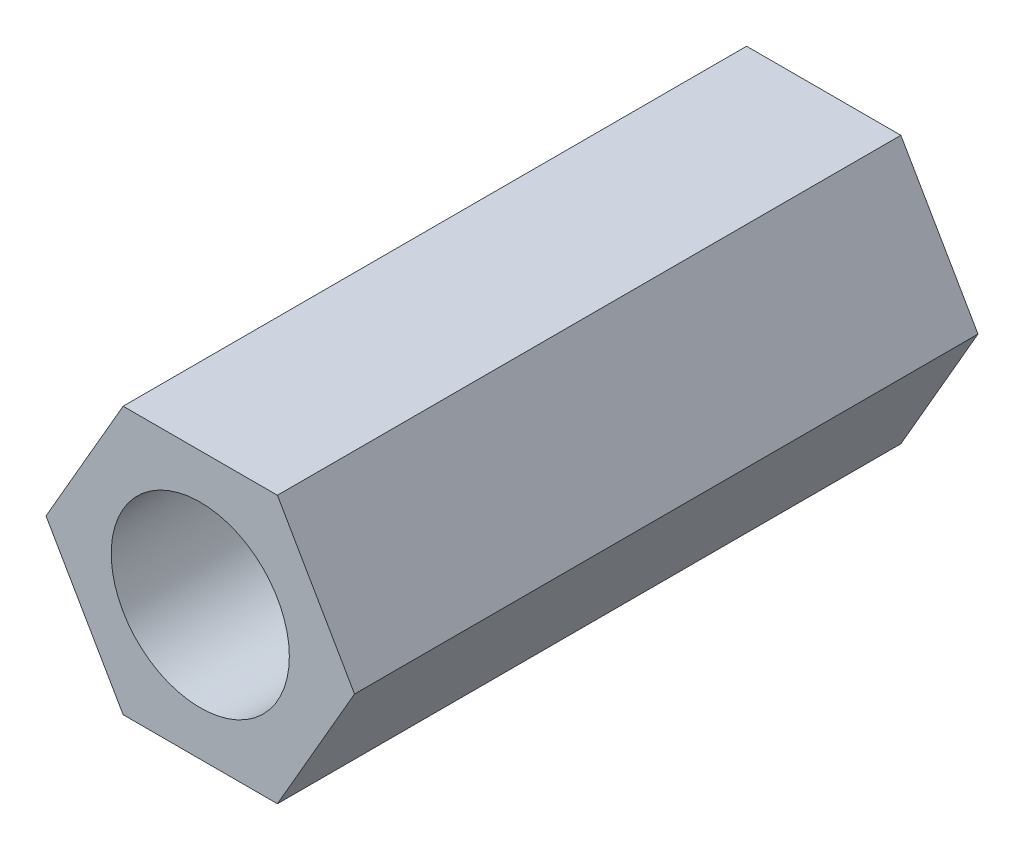
ISO-10303-21;
HEADER;
FILE_DESCRIPTION(('STEP AP214'),'2;1');
FILE_NAME('part.step','',(''),(''),'','','');
FILE_SCHEMA(('AUTOMOTIVE_DESIGN { 1 0 10303 214 1 1 1 1 }'));
ENDSEC;
DATA;
#1=APPLICATION_CONTEXT('core data for automotive mechanical design processes');
#2=APPLICATION_PROTOCOL_DEFINITION('international standard','automotive_design',2000,#1);
#3=PRODUCT_CONTEXT('',#1,'mechanical');
#4=PRODUCT('Part','Part','',(#3));
#5=PRODUCT_RELATED_PRODUCT_CATEGORY('part','',(#4));
#6=PRODUCT_DEFINITION_FORMATION('','',#4);
#7=PRODUCT_DEFINITION_CONTEXT('part definition',#1,'design');
#8=PRODUCT_DEFINITION('design','',#6,#7);
#9=PRODUCT_DEFINITION_SHAPE('','',#8);
#10=(LENGTH_UNIT() NAMED_UNIT(*) SI_UNIT(.MILLI.,.METRE.));
#11=(NAMED_UNIT(*) PLANE_ANGLE_UNIT() SI_UNIT($,.RADIAN.));
#12=(NAMED_UNIT(*) SI_UNIT($,.STERADIAN.) SOLID_ANGLE_UNIT());
#13=UNCERTAINTY_MEASURE_WITH_UNIT(LENGTH_MEASURE(1.E-05),#10,'distance_accuracy_value','');
#14=(GEOMETRIC_REPRESENTATION_CONTEXT(3) GLOBAL_UNCERTAINTY_ASSIGNED_CONTEXT((#13)) GLOBAL_UNIT_ASSIGNED_CONTEXT((#10,
#11,#12)) REPRESENTATION_CONTEXT('',''));
#15=CARTESIAN_POINT('',(0.,0.,0.));
#16=DIRECTION('',(0.,0.,1.));
#17=DIRECTION('',(1.,0.,0.));
#18=AXIS2_PLACEMENT_3D('',#15,#16,#17);
#19=CARTESIAN_POINT('',(0.,0.,7.));
#20=DIRECTION('',(0.,0.,1.));
#21=DIRECTION('',(1.,0.,0.));
#22=AXIS2_PLACEMENT_3D('',#19,#20,#21);
#23=PLANE('',#22);
#24=DIRECTION('',(0.5,0.866025403784438,0.));
#25=VECTOR('',#24,1.);
#26=CARTESIAN_POINT('',(0.86602540378444,-1.5,7.));
#27=LINE('',#26,#25);
#28=CARTESIAN_POINT('',(0.86602540378444,-1.5,7.));
#29=VERTEX_POINT('',#28);
#30=CARTESIAN_POINT('',(1.73205080756888,0.,7.));
#31=VERTEX_POINT('',#30);
#32=EDGE_CURVE('E145',#29,#31,#27,.T.);
#33=ORIENTED_EDGE('',*,*,#32,.T.);
#34=DIRECTION('',(-0.5,0.866025403784438,0.));
#35=VECTOR('',#34,1.);
#36=CARTESIAN_POINT('',(1.73205080756888,0.,7.));
#37=LINE('',#36,#35);
#38=CARTESIAN_POINT('',(0.866025403784438,1.5,7.));
#39=VERTEX_POINT('',#38);
#40=EDGE_CURVE('E93',#31,#39,#37,.T.);
#41=ORIENTED_EDGE('',*,*,#40,.T.);
#42=DIRECTION('',(-1.,0.,0.));
#43=VECTOR('',#42,1.);
#44=CARTESIAN_POINT('',(0.866025403784438,1.5,7.));
#45=LINE('',#44,#43);
#46=CARTESIAN_POINT('',(-0.866025403784439,1.5,7.));
#47=VERTEX_POINT('',#46);
#48=EDGE_CURVE('E106',#39,#47,#45,.T.);
#49=ORIENTED_EDGE('',*,*,#48,.T.);
#50=DIRECTION('',(-0.5,-0.866025403784438,0.));
#51=VECTOR('',#50,1.);
#52=CARTESIAN_POINT('',(-0.866025403784439,1.5,7.));
#53=LINE('',#52,#51);
#54=CARTESIAN_POINT('',(-1.73205080756888,0.,7.));
#55=VERTEX_POINT('',#54);
#56=EDGE_CURVE('E100',#47,#55,#53,.T.);
#57=ORIENTED_EDGE('',*,*,#56,.T.);
#58=DIRECTION('',(0.5,-0.866025403784438,0.));
#59=VECTOR('',#58,1.);
#60=CARTESIAN_POINT('',(-1.73205080756888,0.,7.));
#61=LINE('',#60,#59);
#62=CARTESIAN_POINT('',(-0.866025403784439,-1.5,7.));
#63=VERTEX_POINT('',#62);
#64=EDGE_CURVE('E104',#55,#63,#61,.T.);
#65=ORIENTED_EDGE('',*,*,#64,.T.);
#66=DIRECTION('',(1.,0.,0.));
#67=VECTOR('',#66,1.);
#68=CARTESIAN_POINT('',(-0.866025403784439,-1.5,7.));
#69=LINE('',#68,#67);
#70=EDGE_CURVE('E56',#63,#29,#69,.T.);
#71=ORIENTED_EDGE('',*,*,#70,.T.);
#72=EDGE_LOOP('',(#33,#41,#49,#57,#65,#71));
#73=FACE_BOUND('',#72,.T.);
#74=CARTESIAN_POINT('',(0.,0.,7.));
#75=DIRECTION('',(0.,0.,1.));
#76=DIRECTION('',(1.,0.,0.));
#77=AXIS2_PLACEMENT_3D('',#74,#75,#76);
#78=CIRCLE('',#77,1.);
#79=CARTESIAN_POINT('',(1.,0.,7.));
#80=VERTEX_POINT('',#79);
#81=EDGE_CURVE('E133',#80,#80,#78,.T.);
#82=ORIENTED_EDGE('',*,*,#81,.F.);
#83=EDGE_LOOP('',(#82));
#84=FACE_BOUND('',#83,.T.);
#85=ADVANCED_FACE('F38',(#73,#84),#23,.T.);
#86=CARTESIAN_POINT('',(0.,0.,0.));
#87=DIRECTION('',(0.,0.,1.));
#88=DIRECTION('',(1.,0.,0.));
#89=AXIS2_PLACEMENT_3D('',#86,#87,#88);
#90=PLANE('',#89);
#91=DIRECTION('',(0.5,0.866025403784438,0.));
#92=VECTOR('',#91,1.);
#93=CARTESIAN_POINT('',(0.86602540378444,-1.5,0.));
#94=LINE('',#93,#92);
#95=CARTESIAN_POINT('',(0.86602540378444,-1.5,0.));
#96=VERTEX_POINT('',#95);
#97=CARTESIAN_POINT('',(1.73205080756888,0.,0.));
#98=VERTEX_POINT('',#97);
#99=EDGE_CURVE('E128',#96,#98,#94,.T.);
#100=ORIENTED_EDGE('',*,*,#99,.F.);
#101=DIRECTION('',(1.,0.,0.));
#102=VECTOR('',#101,1.);
#103=CARTESIAN_POINT('',(-0.866025403784439,-1.5,0.));
#104=LINE('',#103,#102);
#105=CARTESIAN_POINT('',(-0.866025403784439,-1.5,0.));
#106=VERTEX_POINT('',#105);
#107=EDGE_CURVE('E85',#106,#96,#104,.T.);
#108=ORIENTED_EDGE('',*,*,#107,.F.);
#109=DIRECTION('',(0.5,-0.866025403784438,0.));
#110=VECTOR('',#109,1.);
#111=CARTESIAN_POINT('',(-1.73205080756888,0.,0.));
#112=LINE('',#111,#110);
#113=CARTESIAN_POINT('',(-1.73205080756888,0.,0.));
#114=VERTEX_POINT('',#113);
#115=EDGE_CURVE('E79',#114,#106,#112,.T.);
#116=ORIENTED_EDGE('',*,*,#115,.F.);
#117=DIRECTION('',(-0.5,-0.866025403784438,0.));
#118=VECTOR('',#117,1.);
#119=CARTESIAN_POINT('',(-0.866025403784439,1.5,0.));
#120=LINE('',#119,#118);
#121=CARTESIAN_POINT('',(-0.866025403784439,1.5,0.));
#122=VERTEX_POINT('',#121);
#123=EDGE_CURVE('E115',#122,#114,#120,.T.);
#124=ORIENTED_EDGE('',*,*,#123,.F.);
#125=DIRECTION('',(-1.,0.,0.));
#126=VECTOR('',#125,1.);
#127=CARTESIAN_POINT('',(0.866025403784438,1.5,0.));
#128=LINE('',#127,#126);
#129=CARTESIAN_POINT('',(0.866025403784438,1.5,0.));
#130=VERTEX_POINT('',#129);
#131=EDGE_CURVE('E136',#130,#122,#128,.T.);
#132=ORIENTED_EDGE('',*,*,#131,.F.);
#133=DIRECTION('',(-0.5,0.866025403784438,0.));
#134=VECTOR('',#133,1.);
#135=CARTESIAN_POINT('',(1.73205080756888,0.,0.));
#136=LINE('',#135,#134);
#137=EDGE_CURVE('E132',#98,#130,#136,.T.);
#138=ORIENTED_EDGE('',*,*,#137,.F.);
#139=EDGE_LOOP('',(#100,#108,#116,#124,#132,#138));
#140=FACE_BOUND('',#139,.T.);
#141=CARTESIAN_POINT('',(0.,0.,0.));
#142=DIRECTION('',(0.,0.,1.));
#143=DIRECTION('',(1.,0.,0.));
#144=AXIS2_PLACEMENT_3D('',#141,#142,#143);
#145=CIRCLE('',#144,1.);
#146=CARTESIAN_POINT('',(1.,0.,0.));
#147=VERTEX_POINT('',#146);
#148=EDGE_CURVE('E242',#147,#147,#145,.T.);
#149=ORIENTED_EDGE('',*,*,#148,.T.);
#150=EDGE_LOOP('',(#149));
#151=FACE_BOUND('',#150,.T.);
#152=ADVANCED_FACE('F158',(#140,#151),#90,.F.);
#153=CARTESIAN_POINT('',(0.86602540378444,-1.5,7.));
#154=DIRECTION('',(-0.866025403784438,0.5,0.));
#155=DIRECTION('',(-0.5,-0.866025403784439,0.));
#156=AXIS2_PLACEMENT_3D('',#153,#154,#155);
#157=PLANE('',#156);
#158=ORIENTED_EDGE('',*,*,#99,.T.);
#159=DIRECTION('',(0.,0.,-1.));
#160=VECTOR('',#159,1.);
#161=CARTESIAN_POINT('',(1.73205080756888,0.,7.));
#162=LINE('',#161,#160);
#163=EDGE_CURVE('E11',#31,#98,#162,.T.);
#164=ORIENTED_EDGE('',*,*,#163,.F.);
#165=ORIENTED_EDGE('',*,*,#32,.F.);
#166=DIRECTION('',(0.,0.,-1.));
#167=VECTOR('',#166,1.);
#168=CARTESIAN_POINT('',(0.86602540378444,-1.5,7.));
#169=LINE('',#168,#167);
#170=EDGE_CURVE('E124',#29,#96,#169,.T.);
#171=ORIENTED_EDGE('',*,*,#170,.T.);
#172=EDGE_LOOP('',(#158,#164,#165,#171));
#173=FACE_BOUND('',#172,.T.);
#174=ADVANCED_FACE('F40',(#173),#157,.F.);
#175=CARTESIAN_POINT('',(1.73205080756888,0.,7.));
#176=DIRECTION('',(-0.866025403784438,-0.5,0.));
#177=DIRECTION('',(0.5,-0.866025403784438,0.));
#178=AXIS2_PLACEMENT_3D('',#175,#176,#177);
#179=PLANE('',#178);
#180=ORIENTED_EDGE('',*,*,#137,.T.);
#181=DIRECTION('',(0.,0.,-1.));
#182=VECTOR('',#181,1.);
#183=CARTESIAN_POINT('',(0.866025403784438,1.5,7.));
#184=LINE('',#183,#182);
#185=EDGE_CURVE('E48',#39,#130,#184,.T.);
#186=ORIENTED_EDGE('',*,*,#185,.F.);
#187=ORIENTED_EDGE('',*,*,#40,.F.);
#188=ORIENTED_EDGE('',*,*,#163,.T.);
#189=EDGE_LOOP('',(#180,#186,#187,#188));
#190=FACE_BOUND('',#189,.T.);
#191=ADVANCED_FACE('F183',(#190),#179,.F.);
#192=CARTESIAN_POINT('',(0.866025403784438,1.5,7.));
#193=DIRECTION('',(0.,-1.,0.));
#194=DIRECTION('',(1.,0.,0.));
#195=AXIS2_PLACEMENT_3D('',#192,#193,#194);
#196=PLANE('',#195);
#197=ORIENTED_EDGE('',*,*,#131,.T.);
#198=DIRECTION('',(0.,0.,-1.));
#199=VECTOR('',#198,1.);
#200=CARTESIAN_POINT('',(-0.866025403784439,1.5,7.));
#201=LINE('',#200,#199);
#202=EDGE_CURVE('E117',#47,#122,#201,.T.);
#203=ORIENTED_EDGE('',*,*,#202,.F.);
#204=ORIENTED_EDGE('',*,*,#48,.F.);
#205=ORIENTED_EDGE('',*,*,#185,.T.);
#206=EDGE_LOOP('',(#197,#203,#204,#205));
#207=FACE_BOUND('',#206,.T.);
#208=ADVANCED_FACE('F155',(#207),#196,.F.);
#209=CARTESIAN_POINT('',(-0.866025403784439,1.5,7.));
#210=DIRECTION('',(0.866025403784438,-0.5,0.));
#211=DIRECTION('',(0.5,0.866025403784439,0.));
#212=AXIS2_PLACEMENT_3D('',#209,#210,#211);
#213=PLANE('',#212);
#214=ORIENTED_EDGE('',*,*,#123,.T.);
#215=DIRECTION('',(0.,0.,-1.));
#216=VECTOR('',#215,1.);
#217=CARTESIAN_POINT('',(-1.73205080756888,0.,7.));
#218=LINE('',#217,#216);
#219=EDGE_CURVE('E112',#55,#114,#218,.T.);
#220=ORIENTED_EDGE('',*,*,#219,.F.);
#221=ORIENTED_EDGE('',*,*,#56,.F.);
#222=ORIENTED_EDGE('',*,*,#202,.T.);
#223=EDGE_LOOP('',(#214,#220,#221,#222));
#224=FACE_BOUND('',#223,.T.);
#225=ADVANCED_FACE('F113',(#224),#213,.F.);
#226=CARTESIAN_POINT('',(-1.73205080756888,0.,7.));
#227=DIRECTION('',(0.866025403784438,0.5,0.));
#228=DIRECTION('',(-0.5,0.866025403784438,0.));
#229=AXIS2_PLACEMENT_3D('',#226,#227,#228);
#230=PLANE('',#229);
#231=ORIENTED_EDGE('',*,*,#115,.T.);
#232=DIRECTION('',(0.,0.,-1.));
#233=VECTOR('',#232,1.);
#234=CARTESIAN_POINT('',(-0.866025403784439,-1.5,7.));
#235=LINE('',#234,#233);
#236=EDGE_CURVE('E118',#63,#106,#235,.T.);
#237=ORIENTED_EDGE('',*,*,#236,.F.);
#238=ORIENTED_EDGE('',*,*,#64,.F.);
#239=ORIENTED_EDGE('',*,*,#219,.T.);
#240=EDGE_LOOP('',(#231,#237,#238,#239));
#241=FACE_BOUND('',#240,.T.);
#242=ADVANCED_FACE('F120',(#241),#230,.F.);
#243=CARTESIAN_POINT('',(-0.866025403784439,-1.5,7.));
#244=DIRECTION('',(0.,1.,0.));
#245=DIRECTION('',(-1.,0.,0.));
#246=AXIS2_PLACEMENT_3D('',#243,#244,#245);
#247=PLANE('',#246);
#248=ORIENTED_EDGE('',*,*,#107,.T.);
#249=ORIENTED_EDGE('',*,*,#170,.F.);
#250=ORIENTED_EDGE('',*,*,#70,.F.);
#251=ORIENTED_EDGE('',*,*,#236,.T.);
#252=EDGE_LOOP('',(#248,#249,#250,#251));
#253=FACE_BOUND('',#252,.T.);
#254=ADVANCED_FACE('F163',(#253),#247,.F.);
#255=CARTESIAN_POINT('',(0.,0.,7.));
#256=DIRECTION('',(0.,0.,-1.));
#257=DIRECTION('',(-1.,0.,0.));
#258=AXIS2_PLACEMENT_3D('',#255,#256,#257);
#259=CYLINDRICAL_SURFACE('',#258,1.);
#260=ORIENTED_EDGE('',*,*,#81,.T.);
#261=EDGE_LOOP('',(#260));
#262=FACE_BOUND('',#261,.T.);
#263=ORIENTED_EDGE('',*,*,#148,.F.);
#264=EDGE_LOOP('',(#263));
#265=FACE_BOUND('',#264,.T.);
#266=ADVANCED_FACE('F165',(#262,#265),#259,.F.);
#267=CLOSED_SHELL('',(#85,#152,#174,#191,#208,#225,#242,#254,#266));
#268=MANIFOLD_SOLID_BREP('B2',#267);
#269=ADVANCED_BREP_SHAPE_REPRESENTATION('',(#18,#268),#14);
#270=SHAPE_DEFINITION_REPRESENTATION(#9,#269);
ENDSEC;
END-ISO-10303-21;
